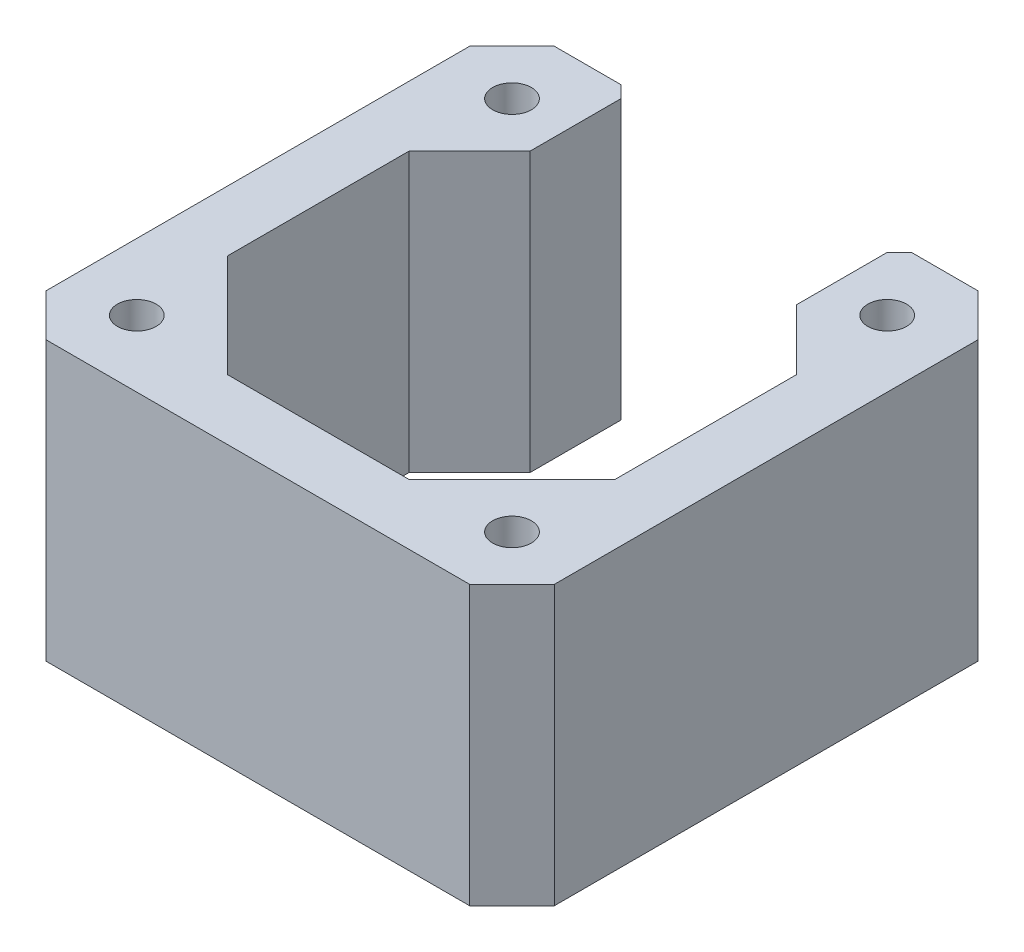
ISO-10303-21;
HEADER;
FILE_DESCRIPTION(('STEP AP214'),'2;1');
FILE_NAME('part.step','',(''),(''),'','','');
FILE_SCHEMA(('AUTOMOTIVE_DESIGN { 1 0 10303 214 1 1 1 1 }'));
ENDSEC;
DATA;
#1=APPLICATION_CONTEXT('core data for automotive mechanical design processes');
#2=APPLICATION_PROTOCOL_DEFINITION('international standard','automotive_design',2000,#1);
#3=PRODUCT_CONTEXT('',#1,'mechanical');
#4=PRODUCT('Part','Part','',(#3));
#5=PRODUCT_RELATED_PRODUCT_CATEGORY('part','',(#4));
#6=PRODUCT_DEFINITION_FORMATION('','',#4);
#7=PRODUCT_DEFINITION_CONTEXT('part definition',#1,'design');
#8=PRODUCT_DEFINITION('design','',#6,#7);
#9=PRODUCT_DEFINITION_SHAPE('','',#8);
#10=(LENGTH_UNIT() NAMED_UNIT(*) SI_UNIT(.MILLI.,.METRE.));
#11=(NAMED_UNIT(*) PLANE_ANGLE_UNIT() SI_UNIT($,.RADIAN.));
#12=(NAMED_UNIT(*) SI_UNIT($,.STERADIAN.) SOLID_ANGLE_UNIT());
#13=UNCERTAINTY_MEASURE_WITH_UNIT(LENGTH_MEASURE(1.E-05),#10,'distance_accuracy_value','');
#14=(GEOMETRIC_REPRESENTATION_CONTEXT(3) GLOBAL_UNCERTAINTY_ASSIGNED_CONTEXT((#13)) GLOBAL_UNIT_ASSIGNED_CONTEXT((#10,
#11,#12)) REPRESENTATION_CONTEXT('',''));
#15=CARTESIAN_POINT('',(0.,0.,0.));
#16=DIRECTION('',(0.,0.,1.));
#17=DIRECTION('',(1.,0.,0.));
#18=AXIS2_PLACEMENT_3D('',#15,#16,#17);
#19=CARTESIAN_POINT('',(-21.,-0.0001,17.49999999825));
#20=DIRECTION('',(-0.707106781186547,0.,0.707106781186548));
#21=DIRECTION('',(0.707106781186548,0.,0.707106781186547));
#22=AXIS2_PLACEMENT_3D('',#19,#20,#21);
#23=PLANE('',#22);
#24=DIRECTION('',(0.,1.,0.));
#25=VECTOR('',#24,1.);
#26=CARTESIAN_POINT('',(-17.5,-0.0001,20.99999999825));
#27=LINE('',#26,#25);
#28=CARTESIAN_POINT('',(-17.5,-0.0001,20.99999999825));
#29=VERTEX_POINT('',#28);
#30=CARTESIAN_POINT('',(-17.5,23.,20.99999999825));
#31=VERTEX_POINT('',#30);
#32=EDGE_CURVE('E40',#29,#31,#27,.T.);
#33=ORIENTED_EDGE('',*,*,#32,.T.);
#34=DIRECTION('',(0.707106781186548,0.,0.707106781186547));
#35=VECTOR('',#34,1.);
#36=CARTESIAN_POINT('',(-21.,23.,17.49999999825));
#37=LINE('',#36,#35);
#38=CARTESIAN_POINT('',(-21.,23.,17.49999999825));
#39=VERTEX_POINT('',#38);
#40=EDGE_CURVE('E173',#39,#31,#37,.T.);
#41=ORIENTED_EDGE('',*,*,#40,.F.);
#42=DIRECTION('',(0.,1.,0.));
#43=VECTOR('',#42,1.);
#44=CARTESIAN_POINT('',(-21.,-0.0001,17.49999999825));
#45=LINE('',#44,#43);
#46=CARTESIAN_POINT('',(-21.,-0.0001,17.49999999825));
#47=VERTEX_POINT('',#46);
#48=EDGE_CURVE('E11',#47,#39,#45,.T.);
#49=ORIENTED_EDGE('',*,*,#48,.F.);
#50=DIRECTION('',(0.707106781186548,0.,0.707106781186547));
#51=VECTOR('',#50,1.);
#52=CARTESIAN_POINT('',(-21.,-0.0001,17.49999999825));
#53=LINE('',#52,#51);
#54=EDGE_CURVE('E174',#47,#29,#53,.T.);
#55=ORIENTED_EDGE('',*,*,#54,.T.);
#56=EDGE_LOOP('',(#33,#41,#49,#55));
#57=FACE_BOUND('',#56,.T.);
#58=ADVANCED_FACE('F37',(#57),#23,.T.);
#59=CARTESIAN_POINT('',(-21.,-0.0001,-17.50000000875));
#60=DIRECTION('',(-1.,0.,0.));
#61=DIRECTION('',(0.,0.,1.));
#62=AXIS2_PLACEMENT_3D('',#59,#60,#61);
#63=PLANE('',#62);
#64=ORIENTED_EDGE('',*,*,#48,.T.);
#65=DIRECTION('',(0.,0.,1.));
#66=VECTOR('',#65,1.);
#67=CARTESIAN_POINT('',(-21.,23.,-17.50000000875));
#68=LINE('',#67,#66);
#69=CARTESIAN_POINT('',(-21.,23.,-17.50000000875));
#70=VERTEX_POINT('',#69);
#71=EDGE_CURVE('E192',#70,#39,#68,.T.);
#72=ORIENTED_EDGE('',*,*,#71,.F.);
#73=DIRECTION('',(0.,1.,0.));
#74=VECTOR('',#73,1.);
#75=CARTESIAN_POINT('',(-21.,-0.0001,-17.50000000875));
#76=LINE('',#75,#74);
#77=CARTESIAN_POINT('',(-21.,-0.0001,-17.50000000875));
#78=VERTEX_POINT('',#77);
#79=EDGE_CURVE('E45',#78,#70,#76,.T.);
#80=ORIENTED_EDGE('',*,*,#79,.F.);
#81=DIRECTION('',(0.,0.,1.));
#82=VECTOR('',#81,1.);
#83=CARTESIAN_POINT('',(-21.,-0.0001,-17.50000000875));
#84=LINE('',#83,#82);
#85=EDGE_CURVE('E179',#78,#47,#84,.T.);
#86=ORIENTED_EDGE('',*,*,#85,.T.);
#87=EDGE_LOOP('',(#64,#72,#80,#86));
#88=FACE_BOUND('',#87,.T.);
#89=ADVANCED_FACE('F417',(#88),#63,.T.);
#90=CARTESIAN_POINT('',(-17.5000000035,-0.0001,-21.00000000525));
#91=DIRECTION('',(-0.707106781186548,0.,-0.707106781186547));
#92=DIRECTION('',(-0.707106781186547,0.,0.707106781186548));
#93=AXIS2_PLACEMENT_3D('',#90,#91,#92);
#94=PLANE('',#93);
#95=ORIENTED_EDGE('',*,*,#79,.T.);
#96=DIRECTION('',(-0.707106781186547,0.,0.707106781186548));
#97=VECTOR('',#96,1.);
#98=CARTESIAN_POINT('',(-17.5000000035,23.,-21.00000000525));
#99=LINE('',#98,#97);
#100=CARTESIAN_POINT('',(-17.5000000035,23.,-21.00000000525));
#101=VERTEX_POINT('',#100);
#102=EDGE_CURVE('E246',#101,#70,#99,.T.);
#103=ORIENTED_EDGE('',*,*,#102,.F.);
#104=DIRECTION('',(0.,1.,0.));
#105=VECTOR('',#104,1.);
#106=CARTESIAN_POINT('',(-17.5000000035,-0.0001,-21.00000000525));
#107=LINE('',#106,#105);
#108=CARTESIAN_POINT('',(-17.5000000035,-0.0001,-21.00000000525));
#109=VERTEX_POINT('',#108);
#110=EDGE_CURVE('E316',#109,#101,#107,.T.);
#111=ORIENTED_EDGE('',*,*,#110,.F.);
#112=DIRECTION('',(-0.707106781186547,0.,0.707106781186548));
#113=VECTOR('',#112,1.);
#114=CARTESIAN_POINT('',(-17.5000000035,-0.0001,-21.00000000525));
#115=LINE('',#114,#113);
#116=EDGE_CURVE('E312',#109,#78,#115,.T.);
#117=ORIENTED_EDGE('',*,*,#116,.T.);
#118=EDGE_LOOP('',(#95,#103,#111,#117));
#119=FACE_BOUND('',#118,.T.);
#120=ADVANCED_FACE('F416',(#119),#94,.T.);
#121=CARTESIAN_POINT('',(-17.5000000035,-0.0001,-21.00000000525));
#122=DIRECTION('',(0.,0.,-1.));
#123=DIRECTION('',(-1.,0.,0.));
#124=AXIS2_PLACEMENT_3D('',#121,#122,#123);
#125=PLANE('',#124);
#126=ORIENTED_EDGE('',*,*,#110,.T.);
#127=DIRECTION('',(-1.,0.,0.));
#128=VECTOR('',#127,1.);
#129=CARTESIAN_POINT('',(-17.5000000035,23.,-21.00000000525));
#130=LINE('',#129,#128);
#131=CARTESIAN_POINT('',(-12.,23.,-21.00000000525));
#132=VERTEX_POINT('',#131);
#133=EDGE_CURVE('E243',#132,#101,#130,.T.);
#134=ORIENTED_EDGE('',*,*,#133,.F.);
#135=DIRECTION('',(0.,1.,0.));
#136=VECTOR('',#135,1.);
#137=CARTESIAN_POINT('',(-12.,-0.0001,-21.00000000525));
#138=LINE('',#137,#136);
#139=CARTESIAN_POINT('',(-12.,-0.0001,-21.00000000525));
#140=VERTEX_POINT('',#139);
#141=EDGE_CURVE('E318',#140,#132,#138,.T.);
#142=ORIENTED_EDGE('',*,*,#141,.F.);
#143=DIRECTION('',(-1.,0.,0.));
#144=VECTOR('',#143,1.);
#145=CARTESIAN_POINT('',(-17.5000000035,-0.0001,-21.00000000525));
#146=LINE('',#145,#144);
#147=EDGE_CURVE('E309',#140,#109,#146,.T.);
#148=ORIENTED_EDGE('',*,*,#147,.T.);
#149=EDGE_LOOP('',(#126,#134,#142,#148));
#150=FACE_BOUND('',#149,.T.);
#151=ADVANCED_FACE('F412',(#150),#125,.T.);
#152=CARTESIAN_POINT('',(-12.,-0.0001,-21.00000000525));
#153=DIRECTION('',(0.707106781040966,0.,-0.707106781332129));
#154=DIRECTION('',(-0.707106781332129,0.,-0.707106781040966));
#155=AXIS2_PLACEMENT_3D('',#152,#153,#154);
#156=PLANE('',#155);
#157=ORIENTED_EDGE('',*,*,#141,.T.);
#158=DIRECTION('',(-0.707106781332129,0.,-0.707106781040966));
#159=VECTOR('',#158,1.);
#160=CARTESIAN_POINT('',(-12.,23.,-21.00000000525));
#161=LINE('',#160,#159);
#162=CARTESIAN_POINT('',(-10.9999999995882,23.,-20.00000000525));
#163=VERTEX_POINT('',#162);
#164=EDGE_CURVE('E240',#163,#132,#161,.T.);
#165=ORIENTED_EDGE('',*,*,#164,.F.);
#166=DIRECTION('',(0.,1.,0.));
#167=VECTOR('',#166,1.);
#168=CARTESIAN_POINT('',(-10.9999999995882,-0.0001,-20.00000000525));
#169=LINE('',#168,#167);
#170=CARTESIAN_POINT('',(-10.9999999995882,-0.0001,-20.00000000525));
#171=VERTEX_POINT('',#170);
#172=EDGE_CURVE('E320',#171,#163,#169,.T.);
#173=ORIENTED_EDGE('',*,*,#172,.F.);
#174=DIRECTION('',(-0.707106781332129,0.,-0.707106781040966));
#175=VECTOR('',#174,1.);
#176=CARTESIAN_POINT('',(-12.,-0.0001,-21.00000000525));
#177=LINE('',#176,#175);
#178=EDGE_CURVE('E306',#171,#140,#177,.T.);
#179=ORIENTED_EDGE('',*,*,#178,.T.);
#180=EDGE_LOOP('',(#157,#165,#173,#179));
#181=FACE_BOUND('',#180,.T.);
#182=ADVANCED_FACE('F407',(#181),#156,.T.);
#183=CARTESIAN_POINT('',(-10.9999999995882,-0.0001,-20.00000000525));
#184=DIRECTION('',(1.,0.,-4.11764372598711E-10));
#185=DIRECTION('',(-4.11764372598711E-10,0.,-1.));
#186=AXIS2_PLACEMENT_3D('',#183,#184,#185);
#187=PLANE('',#186);
#188=ORIENTED_EDGE('',*,*,#172,.T.);
#189=DIRECTION('',(-4.11764372598711E-10,0.,-1.));
#190=VECTOR('',#189,1.);
#191=CARTESIAN_POINT('',(-10.9999999995882,23.,-20.00000000525));
#192=LINE('',#191,#190);
#193=CARTESIAN_POINT('',(-10.9999999965,23.,-12.50000000525));
#194=VERTEX_POINT('',#193);
#195=EDGE_CURVE('E237',#194,#163,#192,.T.);
#196=ORIENTED_EDGE('',*,*,#195,.F.);
#197=DIRECTION('',(0.,1.,0.));
#198=VECTOR('',#197,1.);
#199=CARTESIAN_POINT('',(-10.9999999965,-0.0001,-12.50000000525));
#200=LINE('',#199,#198);
#201=CARTESIAN_POINT('',(-10.9999999965,-0.0001,-12.50000000525));
#202=VERTEX_POINT('',#201);
#203=EDGE_CURVE('E322',#202,#194,#200,.T.);
#204=ORIENTED_EDGE('',*,*,#203,.F.);
#205=DIRECTION('',(-4.11764372598711E-10,0.,-1.));
#206=VECTOR('',#205,1.);
#207=CARTESIAN_POINT('',(-10.9999999995882,-0.0001,-20.00000000525));
#208=LINE('',#207,#206);
#209=EDGE_CURVE('E303',#202,#171,#208,.T.);
#210=ORIENTED_EDGE('',*,*,#209,.T.);
#211=EDGE_LOOP('',(#188,#196,#204,#210));
#212=FACE_BOUND('',#211,.T.);
#213=ADVANCED_FACE('F405',(#212),#187,.T.);
#214=CARTESIAN_POINT('',(-10.9999999965,-0.0001,-12.50000000525));
#215=DIRECTION('',(0.707106781186548,0.,0.707106781186547));
#216=DIRECTION('',(0.707106781186547,0.,-0.707106781186548));
#217=AXIS2_PLACEMENT_3D('',#214,#215,#216);
#218=PLANE('',#217);
#219=ORIENTED_EDGE('',*,*,#203,.T.);
#220=DIRECTION('',(0.707106781186547,0.,-0.707106781186548));
#221=VECTOR('',#220,1.);
#222=CARTESIAN_POINT('',(-10.9999999965,23.,-12.50000000525));
#223=LINE('',#222,#221);
#224=CARTESIAN_POINT('',(-16.,23.,-7.50000000175));
#225=VERTEX_POINT('',#224);
#226=EDGE_CURVE('E234',#225,#194,#223,.T.);
#227=ORIENTED_EDGE('',*,*,#226,.F.);
#228=DIRECTION('',(0.,1.,0.));
#229=VECTOR('',#228,1.);
#230=CARTESIAN_POINT('',(-16.,-0.0001,-7.50000000175));
#231=LINE('',#230,#229);
#232=CARTESIAN_POINT('',(-16.,-0.0001,-7.50000000175));
#233=VERTEX_POINT('',#232);
#234=EDGE_CURVE('E324',#233,#225,#231,.T.);
#235=ORIENTED_EDGE('',*,*,#234,.F.);
#236=DIRECTION('',(0.707106781186547,0.,-0.707106781186548));
#237=VECTOR('',#236,1.);
#238=CARTESIAN_POINT('',(-10.9999999965,-0.0001,-12.50000000525));
#239=LINE('',#238,#237);
#240=EDGE_CURVE('E300',#233,#202,#239,.T.);
#241=ORIENTED_EDGE('',*,*,#240,.T.);
#242=EDGE_LOOP('',(#219,#227,#235,#241));
#243=FACE_BOUND('',#242,.T.);
#244=ADVANCED_FACE('F400',(#243),#218,.T.);
#245=CARTESIAN_POINT('',(-16.,-0.0001,-7.50000000175));
#246=DIRECTION('',(1.,0.,0.));
#247=DIRECTION('',(0.,0.,-1.));
#248=AXIS2_PLACEMENT_3D('',#245,#246,#247);
#249=PLANE('',#248);
#250=ORIENTED_EDGE('',*,*,#234,.T.);
#251=DIRECTION('',(0.,0.,-1.));
#252=VECTOR('',#251,1.);
#253=CARTESIAN_POINT('',(-16.,23.,-7.50000000175));
#254=LINE('',#253,#252);
#255=CARTESIAN_POINT('',(-16.,23.,7.49999999825));
#256=VERTEX_POINT('',#255);
#257=EDGE_CURVE('E231',#256,#225,#254,.T.);
#258=ORIENTED_EDGE('',*,*,#257,.F.);
#259=DIRECTION('',(0.,1.,0.));
#260=VECTOR('',#259,1.);
#261=CARTESIAN_POINT('',(-16.,-0.0001,7.49999999825));
#262=LINE('',#261,#260);
#263=CARTESIAN_POINT('',(-16.,-0.0001,7.49999999825));
#264=VERTEX_POINT('',#263);
#265=EDGE_CURVE('E326',#264,#256,#262,.T.);
#266=ORIENTED_EDGE('',*,*,#265,.F.);
#267=DIRECTION('',(0.,0.,-1.));
#268=VECTOR('',#267,1.);
#269=CARTESIAN_POINT('',(-16.,-0.0001,-7.50000000175));
#270=LINE('',#269,#268);
#271=EDGE_CURVE('E297',#264,#233,#270,.T.);
#272=ORIENTED_EDGE('',*,*,#271,.T.);
#273=EDGE_LOOP('',(#250,#258,#266,#272));
#274=FACE_BOUND('',#273,.T.);
#275=ADVANCED_FACE('F395',(#274),#249,.T.);
#276=CARTESIAN_POINT('',(-16.,-0.0001,7.49999999825));
#277=DIRECTION('',(0.707106781186547,0.,-0.707106781186548));
#278=DIRECTION('',(-0.707106781186548,0.,-0.707106781186547));
#279=AXIS2_PLACEMENT_3D('',#276,#277,#278);
#280=PLANE('',#279);
#281=ORIENTED_EDGE('',*,*,#265,.T.);
#282=DIRECTION('',(-0.707106781186548,0.,-0.707106781186547));
#283=VECTOR('',#282,1.);
#284=CARTESIAN_POINT('',(-16.,23.,7.49999999825));
#285=LINE('',#284,#283);
#286=CARTESIAN_POINT('',(-7.5,23.,15.99999999825));
#287=VERTEX_POINT('',#286);
#288=EDGE_CURVE('E228',#287,#256,#285,.T.);
#289=ORIENTED_EDGE('',*,*,#288,.F.);
#290=DIRECTION('',(0.,1.,0.));
#291=VECTOR('',#290,1.);
#292=CARTESIAN_POINT('',(-7.5,-0.0001,15.99999999825));
#293=LINE('',#292,#291);
#294=CARTESIAN_POINT('',(-7.5,-0.0001,15.99999999825));
#295=VERTEX_POINT('',#294);
#296=EDGE_CURVE('E328',#295,#287,#293,.T.);
#297=ORIENTED_EDGE('',*,*,#296,.F.);
#298=DIRECTION('',(-0.707106781186548,0.,-0.707106781186547));
#299=VECTOR('',#298,1.);
#300=CARTESIAN_POINT('',(-16.,-0.0001,7.49999999825));
#301=LINE('',#300,#299);
#302=EDGE_CURVE('E294',#295,#264,#301,.T.);
#303=ORIENTED_EDGE('',*,*,#302,.T.);
#304=EDGE_LOOP('',(#281,#289,#297,#303));
#305=FACE_BOUND('',#304,.T.);
#306=ADVANCED_FACE('F393',(#305),#280,.T.);
#307=CARTESIAN_POINT('',(-7.5,-0.0001,15.99999999825));
#308=DIRECTION('',(0.,0.,-1.));
#309=DIRECTION('',(-1.,0.,0.));
#310=AXIS2_PLACEMENT_3D('',#307,#308,#309);
#311=PLANE('',#310);
#312=ORIENTED_EDGE('',*,*,#296,.T.);
#313=DIRECTION('',(-1.,0.,0.));
#314=VECTOR('',#313,1.);
#315=CARTESIAN_POINT('',(-7.5,23.,15.99999999825));
#316=LINE('',#315,#314);
#317=CARTESIAN_POINT('',(7.5,23.,15.99999999825));
#318=VERTEX_POINT('',#317);
#319=EDGE_CURVE('E225',#318,#287,#316,.T.);
#320=ORIENTED_EDGE('',*,*,#319,.F.);
#321=DIRECTION('',(0.,1.,0.));
#322=VECTOR('',#321,1.);
#323=CARTESIAN_POINT('',(7.5,-0.0001,15.99999999825));
#324=LINE('',#323,#322);
#325=CARTESIAN_POINT('',(7.5,-0.0001,15.99999999825));
#326=VERTEX_POINT('',#325);
#327=EDGE_CURVE('E330',#326,#318,#324,.T.);
#328=ORIENTED_EDGE('',*,*,#327,.F.);
#329=DIRECTION('',(-1.,0.,0.));
#330=VECTOR('',#329,1.);
#331=CARTESIAN_POINT('',(-7.5,-0.0001,15.99999999825));
#332=LINE('',#331,#330);
#333=EDGE_CURVE('E291',#326,#295,#332,.T.);
#334=ORIENTED_EDGE('',*,*,#333,.T.);
#335=EDGE_LOOP('',(#312,#320,#328,#334));
#336=FACE_BOUND('',#335,.T.);
#337=ADVANCED_FACE('F388',(#336),#311,.T.);
#338=CARTESIAN_POINT('',(16.,-0.0001,7.49999999825));
#339=DIRECTION('',(-0.707106781186547,0.,-0.707106781186548));
#340=DIRECTION('',(-0.707106781186548,0.,0.707106781186547));
#341=AXIS2_PLACEMENT_3D('',#338,#339,#340);
#342=PLANE('',#341);
#343=ORIENTED_EDGE('',*,*,#327,.T.);
#344=DIRECTION('',(-0.707106781186548,0.,0.707106781186547));
#345=VECTOR('',#344,1.);
#346=CARTESIAN_POINT('',(16.,23.,7.49999999825));
#347=LINE('',#346,#345);
#348=CARTESIAN_POINT('',(16.,23.,7.49999999825));
#349=VERTEX_POINT('',#348);
#350=EDGE_CURVE('E222',#349,#318,#347,.T.);
#351=ORIENTED_EDGE('',*,*,#350,.F.);
#352=DIRECTION('',(0.,1.,0.));
#353=VECTOR('',#352,1.);
#354=CARTESIAN_POINT('',(16.,-0.0001,7.49999999825));
#355=LINE('',#354,#353);
#356=CARTESIAN_POINT('',(16.,-0.0001,7.49999999825));
#357=VERTEX_POINT('',#356);
#358=EDGE_CURVE('E332',#357,#349,#355,.T.);
#359=ORIENTED_EDGE('',*,*,#358,.F.);
#360=DIRECTION('',(-0.707106781186548,0.,0.707106781186547));
#361=VECTOR('',#360,1.);
#362=CARTESIAN_POINT('',(16.,-0.0001,7.49999999825));
#363=LINE('',#362,#361);
#364=EDGE_CURVE('E288',#357,#326,#363,.T.);
#365=ORIENTED_EDGE('',*,*,#364,.T.);
#366=EDGE_LOOP('',(#343,#351,#359,#365));
#367=FACE_BOUND('',#366,.T.);
#368=ADVANCED_FACE('F383',(#367),#342,.T.);
#369=CARTESIAN_POINT('',(16.,-0.0001,-7.50000000175));
#370=DIRECTION('',(-1.,0.,0.));
#371=DIRECTION('',(0.,0.,1.));
#372=AXIS2_PLACEMENT_3D('',#369,#370,#371);
#373=PLANE('',#372);
#374=ORIENTED_EDGE('',*,*,#358,.T.);
#375=DIRECTION('',(0.,0.,1.));
#376=VECTOR('',#375,1.);
#377=CARTESIAN_POINT('',(16.,23.,-7.50000000175));
#378=LINE('',#377,#376);
#379=CARTESIAN_POINT('',(16.,23.,-7.50000000175));
#380=VERTEX_POINT('',#379);
#381=EDGE_CURVE('E219',#380,#349,#378,.T.);
#382=ORIENTED_EDGE('',*,*,#381,.F.);
#383=DIRECTION('',(0.,1.,0.));
#384=VECTOR('',#383,1.);
#385=CARTESIAN_POINT('',(16.,-0.0001,-7.50000000175));
#386=LINE('',#385,#384);
#387=CARTESIAN_POINT('',(16.,-0.0001,-7.50000000175));
#388=VERTEX_POINT('',#387);
#389=EDGE_CURVE('E334',#388,#380,#386,.T.);
#390=ORIENTED_EDGE('',*,*,#389,.F.);
#391=DIRECTION('',(0.,0.,1.));
#392=VECTOR('',#391,1.);
#393=CARTESIAN_POINT('',(16.,-0.0001,-7.50000000175));
#394=LINE('',#393,#392);
#395=EDGE_CURVE('E285',#388,#357,#394,.T.);
#396=ORIENTED_EDGE('',*,*,#395,.T.);
#397=EDGE_LOOP('',(#374,#382,#390,#396));
#398=FACE_BOUND('',#397,.T.);
#399=ADVANCED_FACE('F381',(#398),#373,.T.);
#400=CARTESIAN_POINT('',(10.9999999965,-0.0001,-12.50000000525));
#401=DIRECTION('',(-0.707106781186548,0.,0.707106781186547));
#402=DIRECTION('',(0.707106781186547,0.,0.707106781186548));
#403=AXIS2_PLACEMENT_3D('',#400,#401,#402);
#404=PLANE('',#403);
#405=ORIENTED_EDGE('',*,*,#389,.T.);
#406=DIRECTION('',(0.707106781186547,0.,0.707106781186548));
#407=VECTOR('',#406,1.);
#408=CARTESIAN_POINT('',(10.9999999965,23.,-12.50000000525));
#409=LINE('',#408,#407);
#410=CARTESIAN_POINT('',(10.9999999965,23.,-12.50000000525));
#411=VERTEX_POINT('',#410);
#412=EDGE_CURVE('E216',#411,#380,#409,.T.);
#413=ORIENTED_EDGE('',*,*,#412,.F.);
#414=DIRECTION('',(0.,1.,0.));
#415=VECTOR('',#414,1.);
#416=CARTESIAN_POINT('',(10.9999999965,-0.0001,-12.50000000525));
#417=LINE('',#416,#415);
#418=CARTESIAN_POINT('',(10.9999999965,-0.0001,-12.50000000525));
#419=VERTEX_POINT('',#418);
#420=EDGE_CURVE('E336',#419,#411,#417,.T.);
#421=ORIENTED_EDGE('',*,*,#420,.F.);
#422=DIRECTION('',(0.707106781186547,0.,0.707106781186548));
#423=VECTOR('',#422,1.);
#424=CARTESIAN_POINT('',(10.9999999965,-0.0001,-12.50000000525));
#425=LINE('',#424,#423);
#426=EDGE_CURVE('E282',#419,#388,#425,.T.);
#427=ORIENTED_EDGE('',*,*,#426,.T.);
#428=EDGE_LOOP('',(#405,#413,#421,#427));
#429=FACE_BOUND('',#428,.T.);
#430=ADVANCED_FACE('F376',(#429),#404,.T.);
#431=CARTESIAN_POINT('',(10.9999999995882,-0.0001,-20.00000000525));
#432=DIRECTION('',(-1.,0.,-4.11764372598711E-10));
#433=DIRECTION('',(-4.11764372598711E-10,0.,1.));
#434=AXIS2_PLACEMENT_3D('',#431,#432,#433);
#435=PLANE('',#434);
#436=ORIENTED_EDGE('',*,*,#420,.T.);
#437=DIRECTION('',(-4.11764372598711E-10,0.,1.));
#438=VECTOR('',#437,1.);
#439=CARTESIAN_POINT('',(10.9999999995882,23.,-20.00000000525));
#440=LINE('',#439,#438);
#441=CARTESIAN_POINT('',(10.9999999995882,23.,-20.00000000525));
#442=VERTEX_POINT('',#441);
#443=EDGE_CURVE('E213',#442,#411,#440,.T.);
#444=ORIENTED_EDGE('',*,*,#443,.F.);
#445=DIRECTION('',(0.,1.,0.));
#446=VECTOR('',#445,1.);
#447=CARTESIAN_POINT('',(10.9999999995882,-0.0001,-20.00000000525));
#448=LINE('',#447,#446);
#449=CARTESIAN_POINT('',(10.9999999995882,-0.0001,-20.00000000525));
#450=VERTEX_POINT('',#449);
#451=EDGE_CURVE('E338',#450,#442,#448,.T.);
#452=ORIENTED_EDGE('',*,*,#451,.F.);
#453=DIRECTION('',(-4.11764372598711E-10,0.,1.));
#454=VECTOR('',#453,1.);
#455=CARTESIAN_POINT('',(10.9999999995882,-0.0001,-20.00000000525));
#456=LINE('',#455,#454);
#457=EDGE_CURVE('E279',#450,#419,#456,.T.);
#458=ORIENTED_EDGE('',*,*,#457,.T.);
#459=EDGE_LOOP('',(#436,#444,#452,#458));
#460=FACE_BOUND('',#459,.T.);
#461=ADVANCED_FACE('F371',(#460),#435,.T.);
#462=CARTESIAN_POINT('',(12.,-0.0001,-21.00000000525));
#463=DIRECTION('',(-0.707106781040966,0.,-0.707106781332129));
#464=DIRECTION('',(-0.707106781332129,0.,0.707106781040966));
#465=AXIS2_PLACEMENT_3D('',#462,#463,#464);
#466=PLANE('',#465);
#467=ORIENTED_EDGE('',*,*,#451,.T.);
#468=DIRECTION('',(-0.707106781332129,0.,0.707106781040966));
#469=VECTOR('',#468,1.);
#470=CARTESIAN_POINT('',(12.,23.,-21.00000000525));
#471=LINE('',#470,#469);
#472=CARTESIAN_POINT('',(12.,23.,-21.00000000525));
#473=VERTEX_POINT('',#472);
#474=EDGE_CURVE('E210',#473,#442,#471,.T.);
#475=ORIENTED_EDGE('',*,*,#474,.F.);
#476=DIRECTION('',(0.,1.,0.));
#477=VECTOR('',#476,1.);
#478=CARTESIAN_POINT('',(12.,-0.0001,-21.00000000525));
#479=LINE('',#478,#477);
#480=CARTESIAN_POINT('',(12.,-0.0001,-21.00000000525));
#481=VERTEX_POINT('',#480);
#482=EDGE_CURVE('E340',#481,#473,#479,.T.);
#483=ORIENTED_EDGE('',*,*,#482,.F.);
#484=DIRECTION('',(-0.707106781332129,0.,0.707106781040966));
#485=VECTOR('',#484,1.);
#486=CARTESIAN_POINT('',(12.,-0.0001,-21.00000000525));
#487=LINE('',#486,#485);
#488=EDGE_CURVE('E276',#481,#450,#487,.T.);
#489=ORIENTED_EDGE('',*,*,#488,.T.);
#490=EDGE_LOOP('',(#467,#475,#483,#489));
#491=FACE_BOUND('',#490,.T.);
#492=ADVANCED_FACE('F369',(#491),#466,.T.);
#493=CARTESIAN_POINT('',(17.5000000035,-0.0001,-21.00000000525));
#494=DIRECTION('',(0.,0.,-1.));
#495=DIRECTION('',(-1.,0.,0.));
#496=AXIS2_PLACEMENT_3D('',#493,#494,#495);
#497=PLANE('',#496);
#498=ORIENTED_EDGE('',*,*,#482,.T.);
#499=DIRECTION('',(-1.,0.,0.));
#500=VECTOR('',#499,1.);
#501=CARTESIAN_POINT('',(17.5000000035,23.,-21.00000000525));
#502=LINE('',#501,#500);
#503=CARTESIAN_POINT('',(17.5000000035,23.,-21.00000000525));
#504=VERTEX_POINT('',#503);
#505=EDGE_CURVE('E207',#504,#473,#502,.T.);
#506=ORIENTED_EDGE('',*,*,#505,.F.);
#507=DIRECTION('',(0.,1.,0.));
#508=VECTOR('',#507,1.);
#509=CARTESIAN_POINT('',(17.5000000035,-0.0001,-21.00000000525));
#510=LINE('',#509,#508);
#511=CARTESIAN_POINT('',(17.5000000035,-0.0001,-21.00000000525));
#512=VERTEX_POINT('',#511);
#513=EDGE_CURVE('E342',#512,#504,#510,.T.);
#514=ORIENTED_EDGE('',*,*,#513,.F.);
#515=DIRECTION('',(-1.,0.,0.));
#516=VECTOR('',#515,1.);
#517=CARTESIAN_POINT('',(17.5000000035,-0.0001,-21.00000000525));
#518=LINE('',#517,#516);
#519=EDGE_CURVE('E273',#512,#481,#518,.T.);
#520=ORIENTED_EDGE('',*,*,#519,.T.);
#521=EDGE_LOOP('',(#498,#506,#514,#520));
#522=FACE_BOUND('',#521,.T.);
#523=ADVANCED_FACE('F364',(#522),#497,.T.);
#524=CARTESIAN_POINT('',(17.5000000035,-0.0001,-21.00000000525));
#525=DIRECTION('',(0.707106781186548,0.,-0.707106781186547));
#526=DIRECTION('',(-0.707106781186547,0.,-0.707106781186548));
#527=AXIS2_PLACEMENT_3D('',#524,#525,#526);
#528=PLANE('',#527);
#529=ORIENTED_EDGE('',*,*,#513,.T.);
#530=DIRECTION('',(-0.707106781186547,0.,-0.707106781186548));
#531=VECTOR('',#530,1.);
#532=CARTESIAN_POINT('',(17.5000000035,23.,-21.00000000525));
#533=LINE('',#532,#531);
#534=CARTESIAN_POINT('',(21.,23.,-17.50000000875));
#535=VERTEX_POINT('',#534);
#536=EDGE_CURVE('E204',#535,#504,#533,.T.);
#537=ORIENTED_EDGE('',*,*,#536,.F.);
#538=DIRECTION('',(0.,1.,0.));
#539=VECTOR('',#538,1.);
#540=CARTESIAN_POINT('',(21.,-0.0001,-17.50000000875));
#541=LINE('',#540,#539);
#542=CARTESIAN_POINT('',(21.,-0.0001,-17.50000000875));
#543=VERTEX_POINT('',#542);
#544=EDGE_CURVE('E344',#543,#535,#541,.T.);
#545=ORIENTED_EDGE('',*,*,#544,.F.);
#546=DIRECTION('',(-0.707106781186547,0.,-0.707106781186548));
#547=VECTOR('',#546,1.);
#548=CARTESIAN_POINT('',(17.5000000035,-0.0001,-21.00000000525));
#549=LINE('',#548,#547);
#550=EDGE_CURVE('E270',#543,#512,#549,.T.);
#551=ORIENTED_EDGE('',*,*,#550,.T.);
#552=EDGE_LOOP('',(#529,#537,#545,#551));
#553=FACE_BOUND('',#552,.T.);
#554=ADVANCED_FACE('F357',(#553),#528,.T.);
#555=CARTESIAN_POINT('',(21.,-0.0001,-17.50000000875));
#556=DIRECTION('',(1.,0.,0.));
#557=DIRECTION('',(0.,0.,-1.));
#558=AXIS2_PLACEMENT_3D('',#555,#556,#557);
#559=PLANE('',#558);
#560=ORIENTED_EDGE('',*,*,#544,.T.);
#561=DIRECTION('',(0.,0.,-1.));
#562=VECTOR('',#561,1.);
#563=CARTESIAN_POINT('',(21.,23.,-17.50000000875));
#564=LINE('',#563,#562);
#565=CARTESIAN_POINT('',(21.,23.,17.49999999825));
#566=VERTEX_POINT('',#565);
#567=EDGE_CURVE('E201',#566,#535,#564,.T.);
#568=ORIENTED_EDGE('',*,*,#567,.F.);
#569=DIRECTION('',(0.,1.,0.));
#570=VECTOR('',#569,1.);
#571=CARTESIAN_POINT('',(21.,-0.0001,17.49999999825));
#572=LINE('',#571,#570);
#573=CARTESIAN_POINT('',(21.,-0.0001,17.49999999825));
#574=VERTEX_POINT('',#573);
#575=EDGE_CURVE('E346',#574,#566,#572,.T.);
#576=ORIENTED_EDGE('',*,*,#575,.F.);
#577=DIRECTION('',(0.,0.,-1.));
#578=VECTOR('',#577,1.);
#579=CARTESIAN_POINT('',(21.,-0.0001,-17.50000000875));
#580=LINE('',#579,#578);
#581=EDGE_CURVE('E267',#574,#543,#580,.T.);
#582=ORIENTED_EDGE('',*,*,#581,.T.);
#583=EDGE_LOOP('',(#560,#568,#576,#582));
#584=FACE_BOUND('',#583,.T.);
#585=ADVANCED_FACE('F354',(#584),#559,.T.);
#586=CARTESIAN_POINT('',(21.,-0.0001,17.49999999825));
#587=DIRECTION('',(0.707106781186547,0.,0.707106781186548));
#588=DIRECTION('',(0.707106781186548,0.,-0.707106781186547));
#589=AXIS2_PLACEMENT_3D('',#586,#587,#588);
#590=PLANE('',#589);
#591=ORIENTED_EDGE('',*,*,#575,.T.);
#592=DIRECTION('',(0.707106781186548,0.,-0.707106781186547));
#593=VECTOR('',#592,1.);
#594=CARTESIAN_POINT('',(21.,23.,17.49999999825));
#595=LINE('',#594,#593);
#596=CARTESIAN_POINT('',(17.5,23.,20.99999999825));
#597=VERTEX_POINT('',#596);
#598=EDGE_CURVE('E186',#597,#566,#595,.T.);
#599=ORIENTED_EDGE('',*,*,#598,.F.);
#600=DIRECTION('',(0.,1.,0.));
#601=VECTOR('',#600,1.);
#602=CARTESIAN_POINT('',(17.5,-0.0001,20.99999999825));
#603=LINE('',#602,#601);
#604=CARTESIAN_POINT('',(17.5,-0.0001,20.99999999825));
#605=VERTEX_POINT('',#604);
#606=EDGE_CURVE('E178',#605,#597,#603,.T.);
#607=ORIENTED_EDGE('',*,*,#606,.F.);
#608=DIRECTION('',(0.707106781186548,0.,-0.707106781186547));
#609=VECTOR('',#608,1.);
#610=CARTESIAN_POINT('',(21.,-0.0001,17.49999999825));
#611=LINE('',#610,#609);
#612=EDGE_CURVE('E264',#605,#574,#611,.T.);
#613=ORIENTED_EDGE('',*,*,#612,.T.);
#614=EDGE_LOOP('',(#591,#599,#607,#613));
#615=FACE_BOUND('',#614,.T.);
#616=ADVANCED_FACE('F348',(#615),#590,.T.);
#617=CARTESIAN_POINT('',(-17.5,-0.0001,20.99999999825));
#618=DIRECTION('',(0.,0.,1.));
#619=DIRECTION('',(1.,0.,0.));
#620=AXIS2_PLACEMENT_3D('',#617,#618,#619);
#621=PLANE('',#620);
#622=ORIENTED_EDGE('',*,*,#606,.T.);
#623=DIRECTION('',(1.,0.,0.));
#624=VECTOR('',#623,1.);
#625=CARTESIAN_POINT('',(-17.5,23.,20.99999999825));
#626=LINE('',#625,#624);
#627=EDGE_CURVE('E181',#31,#597,#626,.T.);
#628=ORIENTED_EDGE('',*,*,#627,.F.);
#629=ORIENTED_EDGE('',*,*,#32,.F.);
#630=DIRECTION('',(1.,0.,0.));
#631=VECTOR('',#630,1.);
#632=CARTESIAN_POINT('',(-17.5,-0.0001,20.99999999825));
#633=LINE('',#632,#631);
#634=EDGE_CURVE('E262',#29,#605,#633,.T.);
#635=ORIENTED_EDGE('',*,*,#634,.T.);
#636=EDGE_LOOP('',(#622,#628,#629,#635));
#637=FACE_BOUND('',#636,.T.);
#638=ADVANCED_FACE('F182',(#637),#621,.T.);
#639=CARTESIAN_POINT('',(0.,-0.0001,0.));
#640=DIRECTION('',(0.,-1.,0.));
#641=DIRECTION('',(0.,0.,-1.));
#642=AXIS2_PLACEMENT_3D('',#639,#640,#641);
#643=PLANE('',#642);
#644=CARTESIAN_POINT('',(15.50000000175,-0.0001,-15.5));
#645=DIRECTION('',(0.,1.,0.));
#646=DIRECTION('',(0.,0.,-1.));
#647=AXIS2_PLACEMENT_3D('',#644,#645,#646);
#648=CIRCLE('',#647,1.6);
#649=CARTESIAN_POINT('',(15.50000000175,-0.0001,-17.1));
#650=VERTEX_POINT('',#649);
#651=EDGE_CURVE('E249',#650,#650,#648,.T.);
#652=ORIENTED_EDGE('',*,*,#651,.T.);
#653=EDGE_LOOP('',(#652));
#654=FACE_BOUND('',#653,.T.);
#655=CARTESIAN_POINT('',(15.50000000175,-0.0001,15.5));
#656=DIRECTION('',(0.,1.,0.));
#657=DIRECTION('',(0.,0.,-1.));
#658=AXIS2_PLACEMENT_3D('',#655,#656,#657);
#659=CIRCLE('',#658,1.6);
#660=CARTESIAN_POINT('',(15.50000000175,-0.0001,13.9));
#661=VERTEX_POINT('',#660);
#662=EDGE_CURVE('E252',#661,#661,#659,.T.);
#663=ORIENTED_EDGE('',*,*,#662,.T.);
#664=EDGE_LOOP('',(#663));
#665=FACE_BOUND('',#664,.T.);
#666=CARTESIAN_POINT('',(-15.50000000175,-0.0001,15.5));
#667=DIRECTION('',(0.,1.,0.));
#668=DIRECTION('',(0.,0.,1.));
#669=AXIS2_PLACEMENT_3D('',#666,#667,#668);
#670=CIRCLE('',#669,1.6);
#671=CARTESIAN_POINT('',(-15.50000000175,-0.0001,17.1));
#672=VERTEX_POINT('',#671);
#673=EDGE_CURVE('E255',#672,#672,#670,.T.);
#674=ORIENTED_EDGE('',*,*,#673,.T.);
#675=EDGE_LOOP('',(#674));
#676=FACE_BOUND('',#675,.T.);
#677=CARTESIAN_POINT('',(-15.50000000175,-0.0001,-15.5));
#678=DIRECTION('',(0.,1.,0.));
#679=DIRECTION('',(0.,0.,1.));
#680=AXIS2_PLACEMENT_3D('',#677,#678,#679);
#681=CIRCLE('',#680,1.6);
#682=CARTESIAN_POINT('',(-15.50000000175,-0.0001,-13.9));
#683=VERTEX_POINT('',#682);
#684=EDGE_CURVE('E258',#683,#683,#681,.T.);
#685=ORIENTED_EDGE('',*,*,#684,.T.);
#686=EDGE_LOOP('',(#685));
#687=FACE_BOUND('',#686,.T.);
#688=ORIENTED_EDGE('',*,*,#54,.F.);
#689=ORIENTED_EDGE('',*,*,#85,.F.);
#690=ORIENTED_EDGE('',*,*,#116,.F.);
#691=ORIENTED_EDGE('',*,*,#147,.F.);
#692=ORIENTED_EDGE('',*,*,#178,.F.);
#693=ORIENTED_EDGE('',*,*,#209,.F.);
#694=ORIENTED_EDGE('',*,*,#240,.F.);
#695=ORIENTED_EDGE('',*,*,#271,.F.);
#696=ORIENTED_EDGE('',*,*,#302,.F.);
#697=ORIENTED_EDGE('',*,*,#333,.F.);
#698=ORIENTED_EDGE('',*,*,#364,.F.);
#699=ORIENTED_EDGE('',*,*,#395,.F.);
#700=ORIENTED_EDGE('',*,*,#426,.F.);
#701=ORIENTED_EDGE('',*,*,#457,.F.);
#702=ORIENTED_EDGE('',*,*,#488,.F.);
#703=ORIENTED_EDGE('',*,*,#519,.F.);
#704=ORIENTED_EDGE('',*,*,#550,.F.);
#705=ORIENTED_EDGE('',*,*,#581,.F.);
#706=ORIENTED_EDGE('',*,*,#612,.F.);
#707=ORIENTED_EDGE('',*,*,#634,.F.);
#708=EDGE_LOOP('',(#688,#689,#690,#691,#692,#693,#694,#695,#696,#697,#698,#699,#700,#701,#702,
#703,#704,#705,#706,#707));
#709=FACE_BOUND('',#708,.T.);
#710=ADVANCED_FACE('F360',(#654,#665,#676,#687,#709),#643,.T.);
#711=CARTESIAN_POINT('',(-15.50000000175,-0.0001,-15.5));
#712=DIRECTION('',(0.,1.,0.));
#713=DIRECTION('',(0.,0.,1.));
#714=AXIS2_PLACEMENT_3D('',#711,#712,#713);
#715=CYLINDRICAL_SURFACE('',#714,1.6);
#716=ORIENTED_EDGE('',*,*,#684,.F.);
#717=EDGE_LOOP('',(#716));
#718=FACE_BOUND('',#717,.T.);
#719=CARTESIAN_POINT('',(-15.50000000175,23.,-15.5));
#720=DIRECTION('',(0.,1.,0.));
#721=DIRECTION('',(0.,0.,1.));
#722=AXIS2_PLACEMENT_3D('',#719,#720,#721);
#723=CIRCLE('',#722,1.6);
#724=CARTESIAN_POINT('',(-15.50000000175,23.,-13.9));
#725=VERTEX_POINT('',#724);
#726=EDGE_CURVE('E193',#725,#725,#723,.T.);
#727=ORIENTED_EDGE('',*,*,#726,.T.);
#728=EDGE_LOOP('',(#727));
#729=FACE_BOUND('',#728,.T.);
#730=ADVANCED_FACE('F463',(#718,#729),#715,.F.);
#731=CARTESIAN_POINT('',(-15.50000000175,-0.0001,15.5));
#732=DIRECTION('',(0.,1.,0.));
#733=DIRECTION('',(0.,0.,1.));
#734=AXIS2_PLACEMENT_3D('',#731,#732,#733);
#735=CYLINDRICAL_SURFACE('',#734,1.6);
#736=ORIENTED_EDGE('',*,*,#673,.F.);
#737=EDGE_LOOP('',(#736));
#738=FACE_BOUND('',#737,.T.);
#739=CARTESIAN_POINT('',(-15.50000000175,23.,15.5));
#740=DIRECTION('',(0.,1.,0.));
#741=DIRECTION('',(0.,0.,1.));
#742=AXIS2_PLACEMENT_3D('',#739,#740,#741);
#743=CIRCLE('',#742,1.6);
#744=CARTESIAN_POINT('',(-15.50000000175,23.,17.1));
#745=VERTEX_POINT('',#744);
#746=EDGE_CURVE('E196',#745,#745,#743,.T.);
#747=ORIENTED_EDGE('',*,*,#746,.T.);
#748=EDGE_LOOP('',(#747));
#749=FACE_BOUND('',#748,.T.);
#750=ADVANCED_FACE('F468',(#738,#749),#735,.F.);
#751=CARTESIAN_POINT('',(15.50000000175,-0.0001,15.5));
#752=DIRECTION('',(0.,1.,0.));
#753=DIRECTION('',(0.,0.,1.));
#754=AXIS2_PLACEMENT_3D('',#751,#752,#753);
#755=CYLINDRICAL_SURFACE('',#754,1.6);
#756=ORIENTED_EDGE('',*,*,#662,.F.);
#757=EDGE_LOOP('',(#756));
#758=FACE_BOUND('',#757,.T.);
#759=CARTESIAN_POINT('',(15.50000000175,23.,15.5));
#760=DIRECTION('',(0.,1.,0.));
#761=DIRECTION('',(0.,0.,-1.));
#762=AXIS2_PLACEMENT_3D('',#759,#760,#761);
#763=CIRCLE('',#762,1.6);
#764=CARTESIAN_POINT('',(15.50000000175,23.,13.9));
#765=VERTEX_POINT('',#764);
#766=EDGE_CURVE('E489',#765,#765,#763,.T.);
#767=ORIENTED_EDGE('',*,*,#766,.T.);
#768=EDGE_LOOP('',(#767));
#769=FACE_BOUND('',#768,.T.);
#770=ADVANCED_FACE('F498',(#758,#769),#755,.F.);
#771=CARTESIAN_POINT('',(15.50000000175,-0.0001,-15.5));
#772=DIRECTION('',(0.,1.,0.));
#773=DIRECTION('',(0.,0.,1.));
#774=AXIS2_PLACEMENT_3D('',#771,#772,#773);
#775=CYLINDRICAL_SURFACE('',#774,1.6);
#776=ORIENTED_EDGE('',*,*,#651,.F.);
#777=EDGE_LOOP('',(#776));
#778=FACE_BOUND('',#777,.T.);
#779=CARTESIAN_POINT('',(15.50000000175,23.,-15.5));
#780=DIRECTION('',(0.,1.,0.));
#781=DIRECTION('',(0.,0.,-1.));
#782=AXIS2_PLACEMENT_3D('',#779,#780,#781);
#783=CIRCLE('',#782,1.6);
#784=CARTESIAN_POINT('',(15.50000000175,23.,-17.1));
#785=VERTEX_POINT('',#784);
#786=EDGE_CURVE('E492',#785,#785,#783,.T.);
#787=ORIENTED_EDGE('',*,*,#786,.T.);
#788=EDGE_LOOP('',(#787));
#789=FACE_BOUND('',#788,.T.);
#790=ADVANCED_FACE('F481',(#778,#789),#775,.F.);
#791=CARTESIAN_POINT('',(0.,23.,0.));
#792=DIRECTION('',(0.,-1.,0.));
#793=DIRECTION('',(0.,0.,-1.));
#794=AXIS2_PLACEMENT_3D('',#791,#792,#793);
#795=PLANE('',#794);
#796=ORIENTED_EDGE('',*,*,#40,.T.);
#797=ORIENTED_EDGE('',*,*,#627,.T.);
#798=ORIENTED_EDGE('',*,*,#598,.T.);
#799=ORIENTED_EDGE('',*,*,#567,.T.);
#800=ORIENTED_EDGE('',*,*,#536,.T.);
#801=ORIENTED_EDGE('',*,*,#505,.T.);
#802=ORIENTED_EDGE('',*,*,#474,.T.);
#803=ORIENTED_EDGE('',*,*,#443,.T.);
#804=ORIENTED_EDGE('',*,*,#412,.T.);
#805=ORIENTED_EDGE('',*,*,#381,.T.);
#806=ORIENTED_EDGE('',*,*,#350,.T.);
#807=ORIENTED_EDGE('',*,*,#319,.T.);
#808=ORIENTED_EDGE('',*,*,#288,.T.);
#809=ORIENTED_EDGE('',*,*,#257,.T.);
#810=ORIENTED_EDGE('',*,*,#226,.T.);
#811=ORIENTED_EDGE('',*,*,#195,.T.);
#812=ORIENTED_EDGE('',*,*,#164,.T.);
#813=ORIENTED_EDGE('',*,*,#133,.T.);
#814=ORIENTED_EDGE('',*,*,#102,.T.);
#815=ORIENTED_EDGE('',*,*,#71,.T.);
#816=EDGE_LOOP('',(#796,#797,#798,#799,#800,#801,#802,#803,#804,#805,#806,#807,#808,#809,#810,
#811,#812,#813,#814,#815));
#817=FACE_BOUND('',#816,.T.);
#818=ORIENTED_EDGE('',*,*,#726,.F.);
#819=EDGE_LOOP('',(#818));
#820=FACE_BOUND('',#819,.T.);
#821=ORIENTED_EDGE('',*,*,#746,.F.);
#822=EDGE_LOOP('',(#821));
#823=FACE_BOUND('',#822,.T.);
#824=ORIENTED_EDGE('',*,*,#766,.F.);
#825=EDGE_LOOP('',(#824));
#826=FACE_BOUND('',#825,.T.);
#827=ORIENTED_EDGE('',*,*,#786,.F.);
#828=EDGE_LOOP('',(#827));
#829=FACE_BOUND('',#828,.T.);
#830=ADVANCED_FACE('F189',(#817,#820,#823,#826,#829),#795,.F.);
#831=CLOSED_SHELL('',(#58,#89,#120,#151,#182,#213,#244,#275,#306,#337,#368,#399,#430,#461,#492,
#523,#554,#585,#616,#638,#710,#730,#750,#770,#790,#830));
#832=MANIFOLD_SOLID_BREP('B2',#831);
#833=ADVANCED_BREP_SHAPE_REPRESENTATION('',(#18,#832),#14);
#834=SHAPE_DEFINITION_REPRESENTATION(#9,#833);
ENDSEC;
END-ISO-10303-21;
